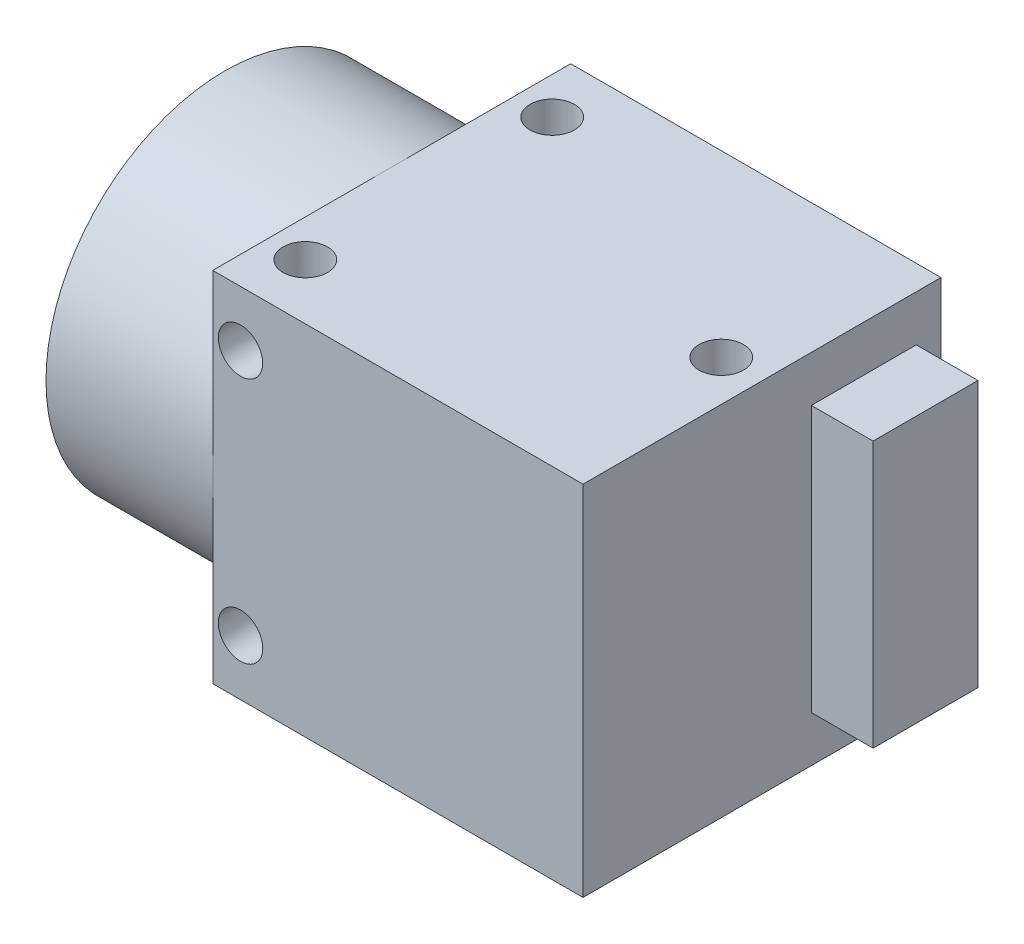
ISO-10303-21;
HEADER;
FILE_DESCRIPTION(('STEP AP214'),'2;1');
FILE_NAME('part.step','',(''),(''),'','','');
FILE_SCHEMA(('AUTOMOTIVE_DESIGN { 1 0 10303 214 1 1 1 1 }'));
ENDSEC;
DATA;
#1=APPLICATION_CONTEXT('core data for automotive mechanical design processes');
#2=APPLICATION_PROTOCOL_DEFINITION('international standard','automotive_design',2000,#1);
#3=PRODUCT_CONTEXT('',#1,'mechanical');
#4=PRODUCT('Part','Part','',(#3));
#5=PRODUCT_RELATED_PRODUCT_CATEGORY('part','',(#4));
#6=PRODUCT_DEFINITION_FORMATION('','',#4);
#7=PRODUCT_DEFINITION_CONTEXT('part definition',#1,'design');
#8=PRODUCT_DEFINITION('design','',#6,#7);
#9=PRODUCT_DEFINITION_SHAPE('','',#8);
#10=(LENGTH_UNIT() NAMED_UNIT(*) SI_UNIT(.MILLI.,.METRE.));
#11=(NAMED_UNIT(*) PLANE_ANGLE_UNIT() SI_UNIT($,.RADIAN.));
#12=(NAMED_UNIT(*) SI_UNIT($,.STERADIAN.) SOLID_ANGLE_UNIT());
#13=UNCERTAINTY_MEASURE_WITH_UNIT(LENGTH_MEASURE(1.E-05),#10,'distance_accuracy_value','');
#14=(GEOMETRIC_REPRESENTATION_CONTEXT(3) GLOBAL_UNCERTAINTY_ASSIGNED_CONTEXT((#13)) GLOBAL_UNIT_ASSIGNED_CONTEXT((#10,
#11,#12)) REPRESENTATION_CONTEXT('',''));
#15=CARTESIAN_POINT('',(0.,0.,0.));
#16=DIRECTION('',(0.,0.,1.));
#17=DIRECTION('',(1.,0.,0.));
#18=AXIS2_PLACEMENT_3D('',#15,#16,#17);
#19=CARTESIAN_POINT('',(48.51,0.,0.));
#20=DIRECTION('',(0.,1.,0.));
#21=DIRECTION('',(0.,0.,1.));
#22=AXIS2_PLACEMENT_3D('',#19,#20,#21);
#23=PLANE('',#22);
#24=CARTESIAN_POINT('',(16.51,0.,-24.5));
#25=DIRECTION('',(0.,1.,0.));
#26=DIRECTION('',(0.,0.,1.));
#27=AXIS2_PLACEMENT_3D('',#24,#25,#26);
#28=CIRCLE('',#27,1.8);
#29=CARTESIAN_POINT('',(16.51,0.,-22.7));
#30=VERTEX_POINT('',#29);
#31=EDGE_CURVE('E202',#30,#30,#28,.T.);
#32=ORIENTED_EDGE('',*,*,#31,.F.);
#33=EDGE_LOOP('',(#32));
#34=FACE_BOUND('',#33,.T.);
#35=CARTESIAN_POINT('',(16.51,0.,-4.50000000000001));
#36=DIRECTION('',(0.,1.,0.));
#37=DIRECTION('',(0.,0.,1.));
#38=AXIS2_PLACEMENT_3D('',#35,#36,#37);
#39=CIRCLE('',#38,1.8);
#40=CARTESIAN_POINT('',(16.51,0.,-2.70000000000001));
#41=VERTEX_POINT('',#40);
#42=EDGE_CURVE('E201',#41,#41,#39,.T.);
#43=ORIENTED_EDGE('',*,*,#42,.F.);
#44=EDGE_LOOP('',(#43));
#45=FACE_BOUND('',#44,.T.);
#46=CARTESIAN_POINT('',(40.21,0.,-14.5));
#47=DIRECTION('',(0.,1.,0.));
#48=DIRECTION('',(0.,0.,1.));
#49=AXIS2_PLACEMENT_3D('',#46,#47,#48);
#50=CIRCLE('',#49,1.8);
#51=CARTESIAN_POINT('',(40.21,0.,-12.7));
#52=VERTEX_POINT('',#51);
#53=EDGE_CURVE('E221',#52,#52,#50,.T.);
#54=ORIENTED_EDGE('',*,*,#53,.F.);
#55=EDGE_LOOP('',(#54));
#56=FACE_BOUND('',#55,.T.);
#57=DIRECTION('',(-1.,0.,0.));
#58=VECTOR('',#57,1.);
#59=CARTESIAN_POINT('',(48.51,0.,0.));
#60=LINE('',#59,#58);
#61=CARTESIAN_POINT('',(43.51,0.,0.));
#62=VERTEX_POINT('',#61);
#63=CARTESIAN_POINT('',(13.51,0.,0.));
#64=VERTEX_POINT('',#63);
#65=EDGE_CURVE('E244',#62,#64,#60,.T.);
#66=ORIENTED_EDGE('',*,*,#65,.F.);
#67=DIRECTION('',(0.,0.,1.));
#68=VECTOR('',#67,1.);
#69=CARTESIAN_POINT('',(43.51,0.,0.));
#70=LINE('',#69,#68);
#71=CARTESIAN_POINT('',(43.51,0.,-29.));
#72=VERTEX_POINT('',#71);
#73=EDGE_CURVE('E315',#72,#62,#70,.T.);
#74=ORIENTED_EDGE('',*,*,#73,.F.);
#75=DIRECTION('',(-1.,0.,0.));
#76=VECTOR('',#75,1.);
#77=CARTESIAN_POINT('',(48.51,0.,-29.));
#78=LINE('',#77,#76);
#79=CARTESIAN_POINT('',(13.51,0.,-29.));
#80=VERTEX_POINT('',#79);
#81=EDGE_CURVE('E245',#72,#80,#78,.T.);
#82=ORIENTED_EDGE('',*,*,#81,.T.);
#83=DIRECTION('',(0.,0.,-1.));
#84=VECTOR('',#83,1.);
#85=CARTESIAN_POINT('',(13.51,0.,0.));
#86=LINE('',#85,#84);
#87=CARTESIAN_POINT('',(13.51,0.,-14.5));
#88=VERTEX_POINT('',#87);
#89=EDGE_CURVE('E348',#88,#80,#86,.T.);
#90=ORIENTED_EDGE('',*,*,#89,.F.);
#91=DIRECTION('',(0.,0.,-1.));
#92=VECTOR('',#91,1.);
#93=CARTESIAN_POINT('',(13.51,0.,0.));
#94=LINE('',#93,#92);
#95=EDGE_CURVE('E319',#64,#88,#94,.T.);
#96=ORIENTED_EDGE('',*,*,#95,.F.);
#97=EDGE_LOOP('',(#66,#74,#82,#90,#96));
#98=FACE_BOUND('',#97,.T.);
#99=ADVANCED_FACE('F81',(#34,#45,#56,#98),#23,.T.);
#100=CARTESIAN_POINT('',(48.51,0.,0.));
#101=DIRECTION('',(0.,0.,-1.));
#102=DIRECTION('',(-1.,0.,0.));
#103=AXIS2_PLACEMENT_3D('',#100,#101,#102);
#104=PLANE('',#103);
#105=CARTESIAN_POINT('',(15.76,-4.50000000000001,0.));
#106=DIRECTION('',(0.,0.,1.));
#107=DIRECTION('',(1.,0.,0.));
#108=AXIS2_PLACEMENT_3D('',#105,#106,#107);
#109=CIRCLE('',#108,1.8);
#110=CARTESIAN_POINT('',(17.56,-4.50000000000001,0.));
#111=VERTEX_POINT('',#110);
#112=EDGE_CURVE('E391',#111,#111,#109,.T.);
#113=ORIENTED_EDGE('',*,*,#112,.F.);
#114=EDGE_LOOP('',(#113));
#115=FACE_BOUND('',#114,.T.);
#116=CARTESIAN_POINT('',(15.76,-24.5,0.));
#117=DIRECTION('',(0.,0.,1.));
#118=DIRECTION('',(1.,0.,0.));
#119=AXIS2_PLACEMENT_3D('',#116,#117,#118);
#120=CIRCLE('',#119,1.8);
#121=CARTESIAN_POINT('',(17.56,-24.5,0.));
#122=VERTEX_POINT('',#121);
#123=EDGE_CURVE('E399',#122,#122,#120,.T.);
#124=ORIENTED_EDGE('',*,*,#123,.F.);
#125=EDGE_LOOP('',(#124));
#126=FACE_BOUND('',#125,.T.);
#127=DIRECTION('',(0.,-1.,0.));
#128=VECTOR('',#127,1.);
#129=CARTESIAN_POINT('',(43.51,0.,0.));
#130=LINE('',#129,#128);
#131=CARTESIAN_POINT('',(43.51,-29.,0.));
#132=VERTEX_POINT('',#131);
#133=EDGE_CURVE('E451',#62,#132,#130,.T.);
#134=ORIENTED_EDGE('',*,*,#133,.F.);
#135=ORIENTED_EDGE('',*,*,#65,.T.);
#136=DIRECTION('',(0.,1.,0.));
#137=VECTOR('',#136,1.);
#138=CARTESIAN_POINT('',(13.51,0.,0.));
#139=LINE('',#138,#137);
#140=CARTESIAN_POINT('',(13.51,-14.5,0.));
#141=VERTEX_POINT('',#140);
#142=EDGE_CURVE('E381',#141,#64,#139,.T.);
#143=ORIENTED_EDGE('',*,*,#142,.F.);
#144=DIRECTION('',(0.,1.,0.));
#145=VECTOR('',#144,1.);
#146=CARTESIAN_POINT('',(13.51,0.,0.));
#147=LINE('',#146,#145);
#148=CARTESIAN_POINT('',(13.51,-29.,0.));
#149=VERTEX_POINT('',#148);
#150=EDGE_CURVE('E364',#149,#141,#147,.T.);
#151=ORIENTED_EDGE('',*,*,#150,.F.);
#152=DIRECTION('',(-1.,0.,0.));
#153=VECTOR('',#152,1.);
#154=CARTESIAN_POINT('',(48.51,-29.,0.));
#155=LINE('',#154,#153);
#156=EDGE_CURVE('E325',#132,#149,#155,.T.);
#157=ORIENTED_EDGE('',*,*,#156,.F.);
#158=EDGE_LOOP('',(#134,#135,#143,#151,#157));
#159=FACE_BOUND('',#158,.T.);
#160=ADVANCED_FACE('F296',(#115,#126,#159),#104,.F.);
#161=CARTESIAN_POINT('',(48.51,-29.,0.));
#162=DIRECTION('',(0.,1.,0.));
#163=DIRECTION('',(0.,0.,1.));
#164=AXIS2_PLACEMENT_3D('',#161,#162,#163);
#165=PLANE('',#164);
#166=DIRECTION('',(0.,0.,-1.));
#167=VECTOR('',#166,1.);
#168=CARTESIAN_POINT('',(43.51,-29.,0.));
#169=LINE('',#168,#167);
#170=CARTESIAN_POINT('',(43.51,-29.,-29.));
#171=VERTEX_POINT('',#170);
#172=EDGE_CURVE('E110',#132,#171,#169,.T.);
#173=ORIENTED_EDGE('',*,*,#172,.F.);
#174=ORIENTED_EDGE('',*,*,#156,.T.);
#175=DIRECTION('',(0.,0.,1.));
#176=VECTOR('',#175,1.);
#177=CARTESIAN_POINT('',(13.51,-29.,0.));
#178=LINE('',#177,#176);
#179=CARTESIAN_POINT('',(13.51,-29.,-14.5));
#180=VERTEX_POINT('',#179);
#181=EDGE_CURVE('E359',#180,#149,#178,.T.);
#182=ORIENTED_EDGE('',*,*,#181,.F.);
#183=DIRECTION('',(0.,0.,1.));
#184=VECTOR('',#183,1.);
#185=CARTESIAN_POINT('',(13.51,-29.,0.));
#186=LINE('',#185,#184);
#187=CARTESIAN_POINT('',(13.51,-29.,-29.));
#188=VERTEX_POINT('',#187);
#189=EDGE_CURVE('E360',#188,#180,#186,.T.);
#190=ORIENTED_EDGE('',*,*,#189,.F.);
#191=DIRECTION('',(-1.,0.,0.));
#192=VECTOR('',#191,1.);
#193=CARTESIAN_POINT('',(48.51,-29.,-29.));
#194=LINE('',#193,#192);
#195=EDGE_CURVE('E328',#171,#188,#194,.T.);
#196=ORIENTED_EDGE('',*,*,#195,.F.);
#197=EDGE_LOOP('',(#173,#174,#182,#190,#196));
#198=FACE_BOUND('',#197,.T.);
#199=ADVANCED_FACE('F302',(#198),#165,.F.);
#200=CARTESIAN_POINT('',(48.51,0.,-29.));
#201=DIRECTION('',(0.,0.,-1.));
#202=DIRECTION('',(-1.,0.,0.));
#203=AXIS2_PLACEMENT_3D('',#200,#201,#202);
#204=PLANE('',#203);
#205=ORIENTED_EDGE('',*,*,#81,.F.);
#206=DIRECTION('',(0.,1.,0.));
#207=VECTOR('',#206,1.);
#208=CARTESIAN_POINT('',(43.51,0.,-29.));
#209=LINE('',#208,#207);
#210=EDGE_CURVE('E422',#171,#72,#209,.T.);
#211=ORIENTED_EDGE('',*,*,#210,.F.);
#212=ORIENTED_EDGE('',*,*,#195,.T.);
#213=DIRECTION('',(0.,-1.,0.));
#214=VECTOR('',#213,1.);
#215=CARTESIAN_POINT('',(13.51,0.,-29.));
#216=LINE('',#215,#214);
#217=CARTESIAN_POINT('',(13.51,-14.5,-29.));
#218=VERTEX_POINT('',#217);
#219=EDGE_CURVE('E373',#218,#188,#216,.T.);
#220=ORIENTED_EDGE('',*,*,#219,.F.);
#221=DIRECTION('',(0.,-1.,0.));
#222=VECTOR('',#221,1.);
#223=CARTESIAN_POINT('',(13.51,0.,-29.));
#224=LINE('',#223,#222);
#225=EDGE_CURVE('E342',#80,#218,#224,.T.);
#226=ORIENTED_EDGE('',*,*,#225,.F.);
#227=EDGE_LOOP('',(#205,#211,#212,#220,#226));
#228=FACE_BOUND('',#227,.T.);
#229=ADVANCED_FACE('F463',(#228),#204,.T.);
#230=CARTESIAN_POINT('',(0.,0.,0.));
#231=DIRECTION('',(-1.,0.,0.));
#232=DIRECTION('',(0.,0.,1.));
#233=AXIS2_PLACEMENT_3D('',#230,#231,#232);
#234=PLANE('',#233);
#235=CARTESIAN_POINT('',(0.,-14.5,-14.5));
#236=DIRECTION('',(-1.,0.,0.));
#237=DIRECTION('',(0.,0.,1.));
#238=AXIS2_PLACEMENT_3D('',#235,#236,#237);
#239=CIRCLE('',#238,14.5);
#240=CARTESIAN_POINT('',(0.,-14.5,0.));
#241=VERTEX_POINT('',#240);
#242=EDGE_CURVE('E355',#241,#241,#239,.T.);
#243=ORIENTED_EDGE('',*,*,#242,.T.);
#244=EDGE_LOOP('',(#243));
#245=FACE_BOUND('',#244,.T.);
#246=ADVANCED_FACE('F479',(#245),#234,.T.);
#247=CARTESIAN_POINT('',(13.51,0.,0.));
#248=DIRECTION('',(-1.,0.,0.));
#249=DIRECTION('',(0.,0.,1.));
#250=AXIS2_PLACEMENT_3D('',#247,#248,#249);
#251=PLANE('',#250);
#252=ORIENTED_EDGE('',*,*,#89,.T.);
#253=ORIENTED_EDGE('',*,*,#225,.T.);
#254=CARTESIAN_POINT('',(13.51,-14.5,-14.5));
#255=DIRECTION('',(-1.,0.,0.));
#256=DIRECTION('',(0.,0.,1.));
#257=AXIS2_PLACEMENT_3D('',#254,#255,#256);
#258=CIRCLE('',#257,14.5);
#259=EDGE_CURVE('E331',#88,#218,#258,.T.);
#260=ORIENTED_EDGE('',*,*,#259,.F.);
#261=EDGE_LOOP('',(#252,#253,#260));
#262=FACE_BOUND('',#261,.T.);
#263=ADVANCED_FACE('F477',(#262),#251,.T.);
#264=CARTESIAN_POINT('',(13.51,-14.5,-14.5));
#265=DIRECTION('',(-1.,0.,0.));
#266=DIRECTION('',(0.,0.,1.));
#267=AXIS2_PLACEMENT_3D('',#264,#265,#266);
#268=CYLINDRICAL_SURFACE('',#267,14.5);
#269=ORIENTED_EDGE('',*,*,#242,.F.);
#270=EDGE_LOOP('',(#269));
#271=FACE_BOUND('',#270,.T.);
#272=CARTESIAN_POINT('',(13.51,-14.5,-14.5));
#273=DIRECTION('',(-1.,0.,0.));
#274=DIRECTION('',(0.,0.,1.));
#275=AXIS2_PLACEMENT_3D('',#272,#273,#274);
#276=CIRCLE('',#275,14.5);
#277=EDGE_CURVE('E384',#141,#88,#276,.T.);
#278=ORIENTED_EDGE('',*,*,#277,.T.);
#279=ORIENTED_EDGE('',*,*,#259,.T.);
#280=CARTESIAN_POINT('',(13.51,-14.5,-14.5));
#281=DIRECTION('',(-1.,0.,0.));
#282=DIRECTION('',(0.,0.,1.));
#283=AXIS2_PLACEMENT_3D('',#280,#281,#282);
#284=CIRCLE('',#283,14.5);
#285=EDGE_CURVE('E376',#218,#180,#284,.T.);
#286=ORIENTED_EDGE('',*,*,#285,.T.);
#287=CARTESIAN_POINT('',(13.51,-14.5,-14.5));
#288=DIRECTION('',(-1.,0.,0.));
#289=DIRECTION('',(0.,0.,1.));
#290=AXIS2_PLACEMENT_3D('',#287,#288,#289);
#291=CIRCLE('',#290,14.5);
#292=EDGE_CURVE('E352',#180,#141,#291,.T.);
#293=ORIENTED_EDGE('',*,*,#292,.T.);
#294=EDGE_LOOP('',(#278,#279,#286,#293));
#295=FACE_BOUND('',#294,.T.);
#296=ADVANCED_FACE('F471',(#271,#295),#268,.T.);
#297=CARTESIAN_POINT('',(13.51,0.,0.));
#298=DIRECTION('',(-1.,0.,0.));
#299=DIRECTION('',(0.,0.,1.));
#300=AXIS2_PLACEMENT_3D('',#297,#298,#299);
#301=PLANE('',#300);
#302=ORIENTED_EDGE('',*,*,#181,.T.);
#303=ORIENTED_EDGE('',*,*,#150,.T.);
#304=ORIENTED_EDGE('',*,*,#292,.F.);
#305=EDGE_LOOP('',(#302,#303,#304));
#306=FACE_BOUND('',#305,.T.);
#307=ADVANCED_FACE('F473',(#306),#301,.T.);
#308=CARTESIAN_POINT('',(13.51,0.,0.));
#309=DIRECTION('',(-1.,0.,0.));
#310=DIRECTION('',(0.,0.,1.));
#311=AXIS2_PLACEMENT_3D('',#308,#309,#310);
#312=PLANE('',#311);
#313=ORIENTED_EDGE('',*,*,#285,.F.);
#314=ORIENTED_EDGE('',*,*,#219,.T.);
#315=ORIENTED_EDGE('',*,*,#189,.T.);
#316=EDGE_LOOP('',(#313,#314,#315));
#317=FACE_BOUND('',#316,.T.);
#318=ADVANCED_FACE('F469',(#317),#312,.T.);
#319=CARTESIAN_POINT('',(13.51,0.,0.));
#320=DIRECTION('',(-1.,0.,0.));
#321=DIRECTION('',(0.,0.,1.));
#322=AXIS2_PLACEMENT_3D('',#319,#320,#321);
#323=PLANE('',#322);
#324=ORIENTED_EDGE('',*,*,#277,.F.);
#325=ORIENTED_EDGE('',*,*,#142,.T.);
#326=ORIENTED_EDGE('',*,*,#95,.T.);
#327=EDGE_LOOP('',(#324,#325,#326));
#328=FACE_BOUND('',#327,.T.);
#329=ADVANCED_FACE('F476',(#328),#323,.T.);
#330=CARTESIAN_POINT('',(15.76,-4.50000000000001,-3.));
#331=DIRECTION('',(0.,0.,1.));
#332=DIRECTION('',(1.,0.,0.));
#333=AXIS2_PLACEMENT_3D('',#330,#331,#332);
#334=CONICAL_SURFACE('',#333,1.8,1.02974425867665);
#335=CARTESIAN_POINT('',(15.76,-4.50000000000001,-4.08154911424961));
#336=VERTEX_POINT('',#335);
#337=VERTEX_LOOP('',#336);
#338=FACE_BOUND('',#337,.T.);
#339=CARTESIAN_POINT('',(16.9434220447609,-3.14327207738831,-2.9998));
#340=CARTESIAN_POINT('',(16.9123958650979,-3.159832826443,-3.01954541569005));
#341=CARTESIAN_POINT('',(16.8811026142634,-3.17605514183907,-3.03917975844644));
#342=CARTESIAN_POINT('',(16.8177099328251,-3.20755867234713,-3.07810490902879));
#343=CARTESIAN_POINT('',(16.7856086612986,-3.22283740012204,-3.0973947209448));
#344=CARTESIAN_POINT('',(16.7195933386987,-3.2525023761952,-3.13592701659342));
#345=CARTESIAN_POINT('',(16.6856537220596,-3.26685283074366,-3.15515380500198));
#346=CARTESIAN_POINT('',(16.6165509330474,-3.29364828473789,-3.19264830631714));
#347=CARTESIAN_POINT('',(16.5813890682581,-3.30609524798295,-3.21091699471375));
#348=CARTESIAN_POINT('',(16.5053706711102,-3.32961904456892,-3.2479627618395));
#349=CARTESIAN_POINT('',(16.464322339004,-3.34037714716436,-3.26655970327306));
#350=CARTESIAN_POINT('',(16.3801389261632,-3.35703412700586,-3.30045179785062));
#351=CARTESIAN_POINT('',(16.3370193079506,-3.36296443037809,-3.31576781857756));
#352=CARTESIAN_POINT('',(16.2568516498468,-3.36785577048632,-3.33890444386862));
#353=CARTESIAN_POINT('',(16.2201303761899,-3.36789052389801,-3.34758258140006));
#354=CARTESIAN_POINT('',(16.1462659013918,-3.36312739979783,-3.36040709613568));
#355=CARTESIAN_POINT('',(16.1091238184521,-3.35834025506117,-3.36456349526797));
#356=CARTESIAN_POINT('',(16.0357172680632,-3.3444236616223,-3.36806743752933));
#357=CARTESIAN_POINT('',(15.9994486885302,-3.3353223831346,-3.36744578512443));
#358=CARTESIAN_POINT('',(15.9279304230665,-3.31376084037879,-3.36202781928941));
#359=CARTESIAN_POINT('',(15.8926938839226,-3.30126912612998,-3.35719143085483));
#360=CARTESIAN_POINT('',(15.8080783190881,-3.26789602630422,-3.3413132550176));
#361=CARTESIAN_POINT('',(15.7595519110895,-3.24578220982641,-3.32845001032975));
#362=CARTESIAN_POINT('',(15.6650098102133,-3.19903452979116,-3.29826866523026));
#363=CARTESIAN_POINT('',(15.6190069219637,-3.17438936328436,-3.28093001005734));
#364=CARTESIAN_POINT('',(15.5310774417709,-3.12497341430307,-3.24431037860097));
#365=CARTESIAN_POINT('',(15.489060912056,-3.10026324533526,-3.2251593848224));
#366=CARTESIAN_POINT('',(15.4067565145397,-3.05034622182528,-3.18525516811995));
#367=CARTESIAN_POINT('',(15.3664556067498,-3.02514675516818,-3.16451978235918));
#368=CARTESIAN_POINT('',(15.326577955239,-2.99980000000016,-3.14327207738847));
#369=B_SPLINE_CURVE_WITH_KNOTS('',3,(#339,#340,#341,#342,#343,#344,#345,#346,#347,#348,#349,
#350,#351,#352,#353,#354,#355,#356,#357,#358,#359,#360,#361,#362,#363,#364,#365,#366,#367,#368),
.UNSPECIFIED.,.F.,.F.,(4,2,2,2,2,2,2,2,2,2,2,2,2,2,4),(0.,0.121015083794998,0.242336633307876,
0.366973209887066,0.491480320756546,0.630204166403798,0.768017614096606,0.880698986958772,
0.993130102107769,1.1048369761222,1.21761772681928,1.3816671447025,1.54648385107907,
1.70353608036912,1.85902572020404),.UNSPECIFIED.);
#370=CARTESIAN_POINT('',(16.9431080460392,-3.14343988286651,-3.));
#371=VERTEX_POINT('',#370);
#372=CARTESIAN_POINT('',(15.3268919539613,-3.,-3.14343988286604));
#373=VERTEX_POINT('',#372);
#374=EDGE_CURVE('E102',#371,#373,#369,.T.);
#375=ORIENTED_EDGE('',*,*,#374,.T.);
#376=CARTESIAN_POINT('',(15.3103920251996,-3.0302,-3.15800867856931));
#377=CARTESIAN_POINT('',(15.3275847975849,-2.99820504058716,-3.14264364516035));
#378=CARTESIAN_POINT('',(15.3454777824292,-2.96659615863518,-3.12723974373176));
#379=CARTESIAN_POINT('',(15.3827378315944,-2.90436212672502,-3.09648139415423));
#380=CARTESIAN_POINT('',(15.4021011257603,-2.87373472919674,-3.08112691817711));
#381=CARTESIAN_POINT('',(15.442459273285,-2.81351559226303,-3.05051770910382));
#382=CARTESIAN_POINT('',(15.4634540969055,-2.78392383399498,-3.03526297419513));
#383=CARTESIAN_POINT('',(15.5072801100757,-2.72590994959589,-3.0049212051023));
#384=CARTESIAN_POINT('',(15.5301157423913,-2.69749091961332,-2.98983468312797));
#385=CARTESIAN_POINT('',(15.5539223109743,-2.66980000000001,-2.97490477262986));
#386=B_SPLINE_CURVE_WITH_KNOTS('',3,(#376,#377,#378,#379,#380,#381,#382,#383,#384,#385),
.UNSPECIFIED.,.F.,.F.,(4,2,2,2,4),(0.,0.118315913702496,0.236338071681386,0.354358078946091,
0.472671982249255),.UNSPECIFIED.);
#387=CARTESIAN_POINT('',(15.5150125628934,-2.71674983368572,-3.));
#388=VERTEX_POINT('',#387);
#389=EDGE_CURVE('E12',#373,#388,#386,.T.);
#390=ORIENTED_EDGE('',*,*,#389,.T.);
#391=CARTESIAN_POINT('',(15.76,-4.50000000000001,-3.));
#392=DIRECTION('',(0.,0.,1.));
#393=DIRECTION('',(1.,0.,0.));
#394=AXIS2_PLACEMENT_3D('',#391,#392,#393);
#395=CIRCLE('',#394,1.8);
#396=EDGE_CURVE('E387',#388,#371,#395,.T.);
#397=ORIENTED_EDGE('',*,*,#396,.T.);
#398=EDGE_LOOP('',(#375,#390,#397));
#399=FACE_BOUND('',#398,.T.);
#400=ADVANCED_FACE('F223',(#338,#399),#334,.F.);
#401=CARTESIAN_POINT('',(15.76,-4.50000000000001,0.));
#402=DIRECTION('',(0.,0.,1.));
#403=DIRECTION('',(1.,0.,0.));
#404=AXIS2_PLACEMENT_3D('',#401,#402,#403);
#405=CYLINDRICAL_SURFACE('',#404,1.8);
#406=ORIENTED_EDGE('',*,*,#396,.F.);
#407=CARTESIAN_POINT('',(15.5150125628934,-2.71674983368572,-3.));
#408=CARTESIAN_POINT('',(15.546794423318,-2.71238347671595,-2.97891768437814));
#409=CARTESIAN_POINT('',(15.5793136445537,-2.70878284067275,-2.95880361961506));
#410=CARTESIAN_POINT('',(15.6456958699732,-2.70332354074091,-2.92061804295834));
#411=CARTESIAN_POINT('',(15.6795596981143,-2.70146596269711,-2.90254781043332));
#412=CARTESIAN_POINT('',(15.7826990012243,-2.69883632412282,-2.85170410851724));
#413=CARTESIAN_POINT('',(15.853719439209,-2.7009779529411,-2.82216669099011));
#414=CARTESIAN_POINT('',(15.9985284934594,-2.71438658198348,-2.7724911430339));
#415=CARTESIAN_POINT('',(16.0723286046826,-2.72569665564198,-2.75239808778891));
#416=CARTESIAN_POINT('',(16.2197931025313,-2.75807979207793,-2.72195400140985));
#417=CARTESIAN_POINT('',(16.2934574978374,-2.77915220701562,-2.71160232396534));
#418=CARTESIAN_POINT('',(16.4341626916454,-2.82943651002865,-2.70028830478231));
#419=CARTESIAN_POINT('',(16.501346126322,-2.85814561685509,-2.69884769372419));
#420=CARTESIAN_POINT('',(16.598992956374,-2.90706966641734,-2.70190394450011));
#421=CARTESIAN_POINT('',(16.6310558048471,-2.92437785509676,-2.70379744762961));
#422=CARTESIAN_POINT('',(16.6939630224296,-2.96083370351,-2.7091475601015));
#423=CARTESIAN_POINT('',(16.7248079948339,-2.97998043594004,-2.71260338468556));
#424=CARTESIAN_POINT('',(16.7549874371066,-3.,-2.71674983368572));
#425=B_SPLINE_CURVE_WITH_KNOTS('',3,(#407,#408,#409,#410,#411,#412,#413,#414,#415,#416,#417,
#418,#419,#420,#421,#422,#423,#424),.UNSPECIFIED.,.F.,.F.,(4,2,2,2,2,2,2,2,4),(0.,
0.115113777431183,0.230299217928503,0.459962857850666,0.690711756028774,0.92144534364813,
1.13967939927526,1.24904990247684,1.35836552951171),.UNSPECIFIED.);
#426=CARTESIAN_POINT('',(16.7549874371066,-3.,-2.71674983368572));
#427=VERTEX_POINT('',#426);
#428=EDGE_CURVE('E95',#388,#427,#425,.T.);
#429=ORIENTED_EDGE('',*,*,#428,.T.);
#430=CARTESIAN_POINT('',(16.7160776890282,-2.97490477263138,-2.66980000000282));
#431=CARTESIAN_POINT('',(16.7398842576108,-2.98983468312937,-2.69749091961595));
#432=CARTESIAN_POINT('',(16.7627198899262,-3.00492120510358,-2.72590994959832));
#433=CARTESIAN_POINT('',(16.8065459030959,-3.03526297419616,-2.78392383399698));
#434=CARTESIAN_POINT('',(16.8275407267163,-3.05051770910472,-2.8135155922648));
#435=CARTESIAN_POINT('',(16.8678988742406,-3.08112691817776,-2.87373472919804));
#436=CARTESIAN_POINT('',(16.8872621684062,-3.09648139415475,-2.90436212672607));
#437=CARTESIAN_POINT('',(16.9245222175711,-3.12723974373203,-2.96659615863572));
#438=CARTESIAN_POINT('',(16.9424152024152,-3.14264364516048,-2.99820504058744));
#439=CARTESIAN_POINT('',(16.9596079748004,-3.15800867856931,-3.0302));
#440=B_SPLINE_CURVE_WITH_KNOTS('',3,(#430,#431,#432,#433,#434,#435,#436,#437,#438,#439),
.UNSPECIFIED.,.F.,.F.,(4,2,2,2,4),(0.,0.118313903302159,0.236333910565866,0.354356068543758,
0.472671982245245),.UNSPECIFIED.);
#441=EDGE_CURVE('E237',#427,#371,#440,.T.);
#442=ORIENTED_EDGE('',*,*,#441,.T.);
#443=EDGE_LOOP('',(#406,#429,#442));
#444=FACE_BOUND('',#443,.T.);
#445=ORIENTED_EDGE('',*,*,#112,.T.);
#446=EDGE_LOOP('',(#445));
#447=FACE_BOUND('',#446,.T.);
#448=ADVANCED_FACE('F251',(#444,#447),#405,.F.);
#449=CARTESIAN_POINT('',(15.76,-24.5,-3.));
#450=DIRECTION('',(0.,0.,1.));
#451=DIRECTION('',(1.,0.,0.));
#452=AXIS2_PLACEMENT_3D('',#449,#450,#451);
#453=CONICAL_SURFACE('',#452,1.8,1.02974425867665);
#454=CARTESIAN_POINT('',(15.76,-24.5,-4.08154911424961));
#455=VERTEX_POINT('',#454);
#456=VERTEX_LOOP('',#455);
#457=FACE_BOUND('',#456,.T.);
#458=CARTESIAN_POINT('',(15.76,-24.5,-3.));
#459=DIRECTION('',(0.,0.,1.));
#460=DIRECTION('',(1.,0.,0.));
#461=AXIS2_PLACEMENT_3D('',#458,#459,#460);
#462=CIRCLE('',#461,1.8);
#463=CARTESIAN_POINT('',(17.56,-24.5,-3.));
#464=VERTEX_POINT('',#463);
#465=EDGE_CURVE('E395',#464,#464,#462,.T.);
#466=ORIENTED_EDGE('',*,*,#465,.T.);
#467=EDGE_LOOP('',(#466));
#468=FACE_BOUND('',#467,.T.);
#469=ADVANCED_FACE('F255',(#457,#468),#453,.F.);
#470=CARTESIAN_POINT('',(15.76,-24.5,0.));
#471=DIRECTION('',(0.,0.,1.));
#472=DIRECTION('',(1.,0.,0.));
#473=AXIS2_PLACEMENT_3D('',#470,#471,#472);
#474=CYLINDRICAL_SURFACE('',#473,1.8);
#475=ORIENTED_EDGE('',*,*,#465,.F.);
#476=EDGE_LOOP('',(#475));
#477=FACE_BOUND('',#476,.T.);
#478=ORIENTED_EDGE('',*,*,#123,.T.);
#479=EDGE_LOOP('',(#478));
#480=FACE_BOUND('',#479,.T.);
#481=ADVANCED_FACE('F260',(#477,#480),#474,.F.);
#482=CARTESIAN_POINT('',(43.51,0.,-18.5));
#483=DIRECTION('',(0.,0.,-1.));
#484=DIRECTION('',(-1.,0.,0.));
#485=AXIS2_PLACEMENT_3D('',#482,#483,#484);
#486=PLANE('',#485);
#487=DIRECTION('',(0.,1.,0.));
#488=VECTOR('',#487,1.);
#489=CARTESIAN_POINT('',(48.51,0.,-18.5));
#490=LINE('',#489,#488);
#491=CARTESIAN_POINT('',(48.51,-25.275,-18.5));
#492=VERTEX_POINT('',#491);
#493=CARTESIAN_POINT('',(48.51,-3.72500000000001,-18.5));
#494=VERTEX_POINT('',#493);
#495=EDGE_CURVE('E431',#492,#494,#490,.T.);
#496=ORIENTED_EDGE('',*,*,#495,.T.);
#497=DIRECTION('',(1.,0.,0.));
#498=VECTOR('',#497,1.);
#499=CARTESIAN_POINT('',(43.51,-3.72500000000001,-18.5));
#500=LINE('',#499,#498);
#501=CARTESIAN_POINT('',(43.51,-3.72500000000001,-18.5));
#502=VERTEX_POINT('',#501);
#503=EDGE_CURVE('E404',#502,#494,#500,.T.);
#504=ORIENTED_EDGE('',*,*,#503,.F.);
#505=DIRECTION('',(0.,1.,0.));
#506=VECTOR('',#505,1.);
#507=CARTESIAN_POINT('',(43.51,0.,-18.5));
#508=LINE('',#507,#506);
#509=CARTESIAN_POINT('',(43.51,-25.275,-18.5));
#510=VERTEX_POINT('',#509);
#511=EDGE_CURVE('E445',#510,#502,#508,.T.);
#512=ORIENTED_EDGE('',*,*,#511,.F.);
#513=DIRECTION('',(1.,0.,0.));
#514=VECTOR('',#513,1.);
#515=CARTESIAN_POINT('',(43.51,-25.275,-18.5));
#516=LINE('',#515,#514);
#517=EDGE_CURVE('E403',#510,#492,#516,.T.);
#518=ORIENTED_EDGE('',*,*,#517,.T.);
#519=EDGE_LOOP('',(#496,#504,#512,#518));
#520=FACE_BOUND('',#519,.T.);
#521=ADVANCED_FACE('F264',(#520),#486,.F.);
#522=CARTESIAN_POINT('',(43.51,-25.275,0.));
#523=DIRECTION('',(0.,-1.,0.));
#524=DIRECTION('',(0.,0.,-1.));
#525=AXIS2_PLACEMENT_3D('',#522,#523,#524);
#526=PLANE('',#525);
#527=DIRECTION('',(0.,0.,-1.));
#528=VECTOR('',#527,1.);
#529=CARTESIAN_POINT('',(48.51,-25.275,0.));
#530=LINE('',#529,#528);
#531=CARTESIAN_POINT('',(48.51,-25.275,-27.));
#532=VERTEX_POINT('',#531);
#533=EDGE_CURVE('E418',#492,#532,#530,.T.);
#534=ORIENTED_EDGE('',*,*,#533,.F.);
#535=ORIENTED_EDGE('',*,*,#517,.F.);
#536=DIRECTION('',(0.,0.,-1.));
#537=VECTOR('',#536,1.);
#538=CARTESIAN_POINT('',(43.51,-25.275,0.));
#539=LINE('',#538,#537);
#540=CARTESIAN_POINT('',(43.51,-25.275,-27.));
#541=VERTEX_POINT('',#540);
#542=EDGE_CURVE('E409',#510,#541,#539,.T.);
#543=ORIENTED_EDGE('',*,*,#542,.T.);
#544=DIRECTION('',(1.,0.,0.));
#545=VECTOR('',#544,1.);
#546=CARTESIAN_POINT('',(43.51,-25.275,-27.));
#547=LINE('',#546,#545);
#548=EDGE_CURVE('E412',#541,#532,#547,.T.);
#549=ORIENTED_EDGE('',*,*,#548,.T.);
#550=EDGE_LOOP('',(#534,#535,#543,#549));
#551=FACE_BOUND('',#550,.T.);
#552=ADVANCED_FACE('F268',(#551),#526,.T.);
#553=CARTESIAN_POINT('',(43.51,0.,-27.));
#554=DIRECTION('',(0.,0.,-1.));
#555=DIRECTION('',(-1.,0.,0.));
#556=AXIS2_PLACEMENT_3D('',#553,#554,#555);
#557=PLANE('',#556);
#558=DIRECTION('',(0.,1.,0.));
#559=VECTOR('',#558,1.);
#560=CARTESIAN_POINT('',(48.51,0.,-27.));
#561=LINE('',#560,#559);
#562=CARTESIAN_POINT('',(48.51,-3.725,-27.));
#563=VERTEX_POINT('',#562);
#564=EDGE_CURVE('E423',#532,#563,#561,.T.);
#565=ORIENTED_EDGE('',*,*,#564,.F.);
#566=ORIENTED_EDGE('',*,*,#548,.F.);
#567=DIRECTION('',(0.,1.,0.));
#568=VECTOR('',#567,1.);
#569=CARTESIAN_POINT('',(43.51,0.,-27.));
#570=LINE('',#569,#568);
#571=CARTESIAN_POINT('',(43.51,-3.725,-27.));
#572=VERTEX_POINT('',#571);
#573=EDGE_CURVE('E438',#541,#572,#570,.T.);
#574=ORIENTED_EDGE('',*,*,#573,.T.);
#575=DIRECTION('',(1.,0.,0.));
#576=VECTOR('',#575,1.);
#577=CARTESIAN_POINT('',(43.51,-3.725,-27.));
#578=LINE('',#577,#576);
#579=EDGE_CURVE('E408',#572,#563,#578,.T.);
#580=ORIENTED_EDGE('',*,*,#579,.T.);
#581=EDGE_LOOP('',(#565,#566,#574,#580));
#582=FACE_BOUND('',#581,.T.);
#583=ADVANCED_FACE('F274',(#582),#557,.T.);
#584=CARTESIAN_POINT('',(43.51,-3.72500000000001,0.));
#585=DIRECTION('',(0.,-1.,0.));
#586=DIRECTION('',(0.,0.,-1.));
#587=AXIS2_PLACEMENT_3D('',#584,#585,#586);
#588=PLANE('',#587);
#589=DIRECTION('',(0.,0.,-1.));
#590=VECTOR('',#589,1.);
#591=CARTESIAN_POINT('',(48.51,-3.72500000000001,0.));
#592=LINE('',#591,#590);
#593=EDGE_CURVE('E427',#494,#563,#592,.T.);
#594=ORIENTED_EDGE('',*,*,#593,.T.);
#595=ORIENTED_EDGE('',*,*,#579,.F.);
#596=DIRECTION('',(0.,0.,-1.));
#597=VECTOR('',#596,1.);
#598=CARTESIAN_POINT('',(43.51,-3.72500000000001,0.));
#599=LINE('',#598,#597);
#600=EDGE_CURVE('E441',#502,#572,#599,.T.);
#601=ORIENTED_EDGE('',*,*,#600,.F.);
#602=ORIENTED_EDGE('',*,*,#503,.T.);
#603=EDGE_LOOP('',(#594,#595,#601,#602));
#604=FACE_BOUND('',#603,.T.);
#605=ADVANCED_FACE('F270',(#604),#588,.F.);
#606=CARTESIAN_POINT('',(43.51,0.,0.));
#607=DIRECTION('',(1.,0.,0.));
#608=DIRECTION('',(0.,0.,-1.));
#609=AXIS2_PLACEMENT_3D('',#606,#607,#608);
#610=PLANE('',#609);
#611=ORIENTED_EDGE('',*,*,#210,.T.);
#612=ORIENTED_EDGE('',*,*,#73,.T.);
#613=ORIENTED_EDGE('',*,*,#133,.T.);
#614=ORIENTED_EDGE('',*,*,#172,.T.);
#615=EDGE_LOOP('',(#611,#612,#613,#614));
#616=FACE_BOUND('',#615,.T.);
#617=ORIENTED_EDGE('',*,*,#511,.T.);
#618=ORIENTED_EDGE('',*,*,#600,.T.);
#619=ORIENTED_EDGE('',*,*,#573,.F.);
#620=ORIENTED_EDGE('',*,*,#542,.F.);
#621=EDGE_LOOP('',(#617,#618,#619,#620));
#622=FACE_BOUND('',#621,.T.);
#623=ADVANCED_FACE('F273',(#616,#622),#610,.T.);
#624=CARTESIAN_POINT('',(48.51,0.,0.));
#625=DIRECTION('',(-1.,0.,0.));
#626=DIRECTION('',(0.,0.,1.));
#627=AXIS2_PLACEMENT_3D('',#624,#625,#626);
#628=PLANE('',#627);
#629=ORIENTED_EDGE('',*,*,#593,.F.);
#630=ORIENTED_EDGE('',*,*,#495,.F.);
#631=ORIENTED_EDGE('',*,*,#533,.T.);
#632=ORIENTED_EDGE('',*,*,#564,.T.);
#633=EDGE_LOOP('',(#629,#630,#631,#632));
#634=FACE_BOUND('',#633,.T.);
#635=ADVANCED_FACE('F283',(#634),#628,.F.);
#636=CARTESIAN_POINT('',(40.21,-3.00000000000001,-14.5));
#637=DIRECTION('',(0.,1.,0.));
#638=DIRECTION('',(0.,0.,1.));
#639=AXIS2_PLACEMENT_3D('',#636,#637,#638);
#640=CONICAL_SURFACE('',#639,1.8,1.02974425867665);
#641=CARTESIAN_POINT('',(40.21,-4.08154911424962,-14.5));
#642=VERTEX_POINT('',#641);
#643=VERTEX_LOOP('',#642);
#644=FACE_BOUND('',#643,.T.);
#645=CARTESIAN_POINT('',(40.21,-3.00000000000001,-14.5));
#646=DIRECTION('',(0.,1.,0.));
#647=DIRECTION('',(0.,0.,1.));
#648=AXIS2_PLACEMENT_3D('',#645,#646,#647);
#649=CIRCLE('',#648,1.8);
#650=CARTESIAN_POINT('',(40.21,-3.00000000000001,-12.7));
#651=VERTEX_POINT('',#650);
#652=EDGE_CURVE('E434',#651,#651,#649,.T.);
#653=ORIENTED_EDGE('',*,*,#652,.T.);
#654=EDGE_LOOP('',(#653));
#655=FACE_BOUND('',#654,.T.);
#656=ADVANCED_FACE('F284',(#644,#655),#640,.F.);
#657=CARTESIAN_POINT('',(40.21,0.,-14.5));
#658=DIRECTION('',(0.,1.,0.));
#659=DIRECTION('',(0.,0.,1.));
#660=AXIS2_PLACEMENT_3D('',#657,#658,#659);
#661=CYLINDRICAL_SURFACE('',#660,1.8);
#662=ORIENTED_EDGE('',*,*,#652,.F.);
#663=EDGE_LOOP('',(#662));
#664=FACE_BOUND('',#663,.T.);
#665=ORIENTED_EDGE('',*,*,#53,.T.);
#666=EDGE_LOOP('',(#665));
#667=FACE_BOUND('',#666,.T.);
#668=ADVANCED_FACE('F233',(#664,#667),#661,.F.);
#669=CARTESIAN_POINT('',(16.51,0.,-4.50000000000001));
#670=DIRECTION('',(0.,1.,0.));
#671=DIRECTION('',(0.,0.,1.));
#672=AXIS2_PLACEMENT_3D('',#669,#670,#671);
#673=CYLINDRICAL_SURFACE('',#672,1.8);
#674=ORIENTED_EDGE('',*,*,#42,.T.);
#675=EDGE_LOOP('',(#674));
#676=FACE_BOUND('',#675,.T.);
#677=CARTESIAN_POINT('',(16.51,-3.,-4.50000000000001));
#678=DIRECTION('',(0.,1.,0.));
#679=DIRECTION('',(0.,0.,1.));
#680=AXIS2_PLACEMENT_3D('',#677,#678,#679);
#681=CIRCLE('',#680,1.8);
#682=EDGE_CURVE('E207',#427,#373,#681,.T.);
#683=ORIENTED_EDGE('',*,*,#682,.F.);
#684=ORIENTED_EDGE('',*,*,#428,.F.);
#685=ORIENTED_EDGE('',*,*,#389,.F.);
#686=EDGE_LOOP('',(#683,#684,#685));
#687=FACE_BOUND('',#686,.T.);
#688=ADVANCED_FACE('F230',(#676,#687),#673,.F.);
#689=CARTESIAN_POINT('',(16.51,-3.,-4.50000000000001));
#690=DIRECTION('',(0.,1.,0.));
#691=DIRECTION('',(0.,0.,1.));
#692=AXIS2_PLACEMENT_3D('',#689,#690,#691);
#693=CONICAL_SURFACE('',#692,1.8,1.02974425867665);
#694=CARTESIAN_POINT('',(16.51,-4.08154911424961,-4.50000000000001));
#695=VERTEX_POINT('',#694);
#696=VERTEX_LOOP('',#695);
#697=FACE_BOUND('',#696,.T.);
#698=ORIENTED_EDGE('',*,*,#441,.F.);
#699=ORIENTED_EDGE('',*,*,#682,.T.);
#700=ORIENTED_EDGE('',*,*,#374,.F.);
#701=EDGE_LOOP('',(#698,#699,#700));
#702=FACE_BOUND('',#701,.T.);
#703=ADVANCED_FACE('F194',(#697,#702),#693,.F.);
#704=CARTESIAN_POINT('',(16.51,-3.00000000000001,-24.5));
#705=DIRECTION('',(0.,1.,0.));
#706=DIRECTION('',(0.,0.,1.));
#707=AXIS2_PLACEMENT_3D('',#704,#705,#706);
#708=CONICAL_SURFACE('',#707,1.8,1.02974425867665);
#709=CARTESIAN_POINT('',(16.51,-4.08154911424962,-24.5));
#710=VERTEX_POINT('',#709);
#711=VERTEX_LOOP('',#710);
#712=FACE_BOUND('',#711,.T.);
#713=CARTESIAN_POINT('',(16.51,-3.00000000000001,-24.5));
#714=DIRECTION('',(0.,1.,0.));
#715=DIRECTION('',(0.,0.,1.));
#716=AXIS2_PLACEMENT_3D('',#713,#714,#715);
#717=CIRCLE('',#716,1.8);
#718=CARTESIAN_POINT('',(16.51,-3.00000000000001,-22.7));
#719=VERTEX_POINT('',#718);
#720=EDGE_CURVE('E198',#719,#719,#717,.T.);
#721=ORIENTED_EDGE('',*,*,#720,.T.);
#722=EDGE_LOOP('',(#721));
#723=FACE_BOUND('',#722,.T.);
#724=ADVANCED_FACE('F190',(#712,#723),#708,.F.);
#725=CARTESIAN_POINT('',(16.51,0.,-24.5));
#726=DIRECTION('',(0.,1.,0.));
#727=DIRECTION('',(0.,0.,1.));
#728=AXIS2_PLACEMENT_3D('',#725,#726,#727);
#729=CYLINDRICAL_SURFACE('',#728,1.8);
#730=ORIENTED_EDGE('',*,*,#720,.F.);
#731=EDGE_LOOP('',(#730));
#732=FACE_BOUND('',#731,.T.);
#733=ORIENTED_EDGE('',*,*,#31,.T.);
#734=EDGE_LOOP('',(#733));
#735=FACE_BOUND('',#734,.T.);
#736=ADVANCED_FACE('F193',(#732,#735),#729,.F.);
#737=CLOSED_SHELL('',(#99,#160,#199,#229,#246,#263,#296,#307,#318,#329,#400,#448,#469,#481,#521,
#552,#583,#605,#623,#635,#656,#668,#688,#703,#724,#736));
#738=MANIFOLD_SOLID_BREP('B2',#737);
#739=ADVANCED_BREP_SHAPE_REPRESENTATION('',(#18,#738),#14);
#740=SHAPE_DEFINITION_REPRESENTATION(#9,#739);
ENDSEC;
END-ISO-10303-21;
